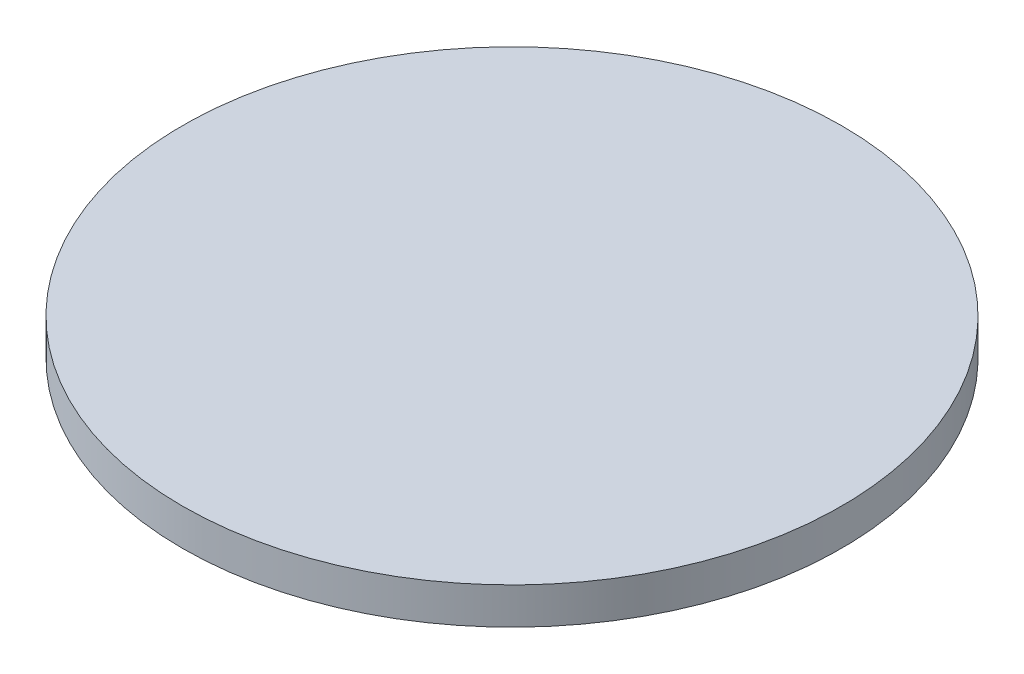
ISO-10303-21;
HEADER;
FILE_DESCRIPTION(('STEP AP214'),'2;1');
FILE_NAME('part.step','',(''),(''),'','','');
FILE_SCHEMA(('AUTOMOTIVE_DESIGN { 1 0 10303 214 1 1 1 1 }'));
ENDSEC;
DATA;
#1=APPLICATION_CONTEXT('core data for automotive mechanical design processes');
#2=APPLICATION_PROTOCOL_DEFINITION('international standard','automotive_design',2000,#1);
#3=PRODUCT_CONTEXT('',#1,'mechanical');
#4=PRODUCT('Part','Part','',(#3));
#5=PRODUCT_RELATED_PRODUCT_CATEGORY('part','',(#4));
#6=PRODUCT_DEFINITION_FORMATION('','',#4);
#7=PRODUCT_DEFINITION_CONTEXT('part definition',#1,'design');
#8=PRODUCT_DEFINITION('design','',#6,#7);
#9=PRODUCT_DEFINITION_SHAPE('','',#8);
#10=(LENGTH_UNIT() NAMED_UNIT(*) SI_UNIT(.MILLI.,.METRE.));
#11=(NAMED_UNIT(*) PLANE_ANGLE_UNIT() SI_UNIT($,.RADIAN.));
#12=(NAMED_UNIT(*) SI_UNIT($,.STERADIAN.) SOLID_ANGLE_UNIT());
#13=UNCERTAINTY_MEASURE_WITH_UNIT(LENGTH_MEASURE(1.E-05),#10,'distance_accuracy_value','');
#14=(GEOMETRIC_REPRESENTATION_CONTEXT(3) GLOBAL_UNCERTAINTY_ASSIGNED_CONTEXT((#13)) GLOBAL_UNIT_ASSIGNED_CONTEXT((#10,
#11,#12)) REPRESENTATION_CONTEXT('',''));
#15=CARTESIAN_POINT('',(0.,0.,0.));
#16=DIRECTION('',(0.,0.,1.));
#17=DIRECTION('',(1.,0.,0.));
#18=AXIS2_PLACEMENT_3D('',#15,#16,#17);
#19=CARTESIAN_POINT('',(0.,12.7,0.));
#20=DIRECTION('',(0.,-1.,0.));
#21=DIRECTION('',(0.,0.,-1.));
#22=AXIS2_PLACEMENT_3D('',#19,#20,#21);
#23=CYLINDRICAL_SURFACE('',#22,114.3);
#24=CARTESIAN_POINT('',(0.,12.7,0.));
#25=DIRECTION('',(0.,1.,0.));
#26=DIRECTION('',(0.,0.,1.));
#27=AXIS2_PLACEMENT_3D('',#24,#25,#26);
#28=CIRCLE('',#27,114.3);
#29=CARTESIAN_POINT('',(0.,12.7,-114.3));
#30=VERTEX_POINT('',#29);
#31=EDGE_CURVE('E10',#30,#30,#28,.T.);
#32=CARTESIAN_POINT('',(0.,0.,0.));
#33=DIRECTION('',(0.,1.,0.));
#34=DIRECTION('',(0.,0.,1.));
#35=AXIS2_PLACEMENT_3D('',#32,#33,#34);
#36=CIRCLE('',#35,114.3);
#37=CARTESIAN_POINT('',(0.,0.,-114.3));
#38=VERTEX_POINT('',#37);
#39=EDGE_CURVE('E34',#38,#38,#36,.T.);
#40=CARTESIAN_POINT('',(0.,12.7,-114.3));
#41=CARTESIAN_POINT('',(0.,12.5677083333333,-114.3));
#42=CARTESIAN_POINT('',(0.,12.4354166666667,-114.3));
#43=CARTESIAN_POINT('',(0.,12.1708333333333,-114.3));
#44=CARTESIAN_POINT('',(0.,12.0385416666667,-114.3));
#45=CARTESIAN_POINT('',(0.,11.7739583333333,-114.3));
#46=CARTESIAN_POINT('',(0.,11.6416666666667,-114.3));
#47=CARTESIAN_POINT('',(0.,11.3770833333333,-114.3));
#48=CARTESIAN_POINT('',(0.,11.2447916666667,-114.3));
#49=CARTESIAN_POINT('',(0.,10.9802083333333,-114.3));
#50=CARTESIAN_POINT('',(0.,10.8479166666667,-114.3));
#51=CARTESIAN_POINT('',(0.,10.5833333333333,-114.3));
#52=CARTESIAN_POINT('',(0.,10.4510416666667,-114.3));
#53=CARTESIAN_POINT('',(0.,10.1864583333333,-114.3));
#54=CARTESIAN_POINT('',(0.,10.0541666666667,-114.3));
#55=CARTESIAN_POINT('',(0.,9.78958333333333,-114.3));
#56=CARTESIAN_POINT('',(0.,9.65729166666667,-114.3));
#57=CARTESIAN_POINT('',(0.,9.39270833333333,-114.3));
#58=CARTESIAN_POINT('',(0.,9.26041666666667,-114.3));
#59=CARTESIAN_POINT('',(0.,8.99583333333333,-114.3));
#60=CARTESIAN_POINT('',(0.,8.86354166666667,-114.3));
#61=CARTESIAN_POINT('',(0.,8.59895833333333,-114.3));
#62=CARTESIAN_POINT('',(0.,8.46666666666667,-114.3));
#63=CARTESIAN_POINT('',(0.,8.20208333333333,-114.3));
#64=CARTESIAN_POINT('',(0.,8.06979166666667,-114.3));
#65=CARTESIAN_POINT('',(0.,7.80520833333333,-114.3));
#66=CARTESIAN_POINT('',(0.,7.67291666666667,-114.3));
#67=CARTESIAN_POINT('',(0.,7.40833333333333,-114.3));
#68=CARTESIAN_POINT('',(0.,7.27604166666667,-114.3));
#69=CARTESIAN_POINT('',(0.,7.01145833333333,-114.3));
#70=CARTESIAN_POINT('',(0.,6.87916666666667,-114.3));
#71=CARTESIAN_POINT('',(0.,6.61458333333333,-114.3));
#72=CARTESIAN_POINT('',(0.,6.48229166666667,-114.3));
#73=CARTESIAN_POINT('',(0.,6.21770833333333,-114.3));
#74=CARTESIAN_POINT('',(0.,6.08541666666667,-114.3));
#75=CARTESIAN_POINT('',(0.,5.82083333333333,-114.3));
#76=CARTESIAN_POINT('',(0.,5.68854166666667,-114.3));
#77=CARTESIAN_POINT('',(0.,5.42395833333333,-114.3));
#78=CARTESIAN_POINT('',(0.,5.29166666666667,-114.3));
#79=CARTESIAN_POINT('',(0.,5.02708333333333,-114.3));
#80=CARTESIAN_POINT('',(0.,4.89479166666667,-114.3));
#81=CARTESIAN_POINT('',(0.,4.63020833333333,-114.3));
#82=CARTESIAN_POINT('',(0.,4.49791666666667,-114.3));
#83=CARTESIAN_POINT('',(0.,4.23333333333333,-114.3));
#84=CARTESIAN_POINT('',(0.,4.10104166666667,-114.3));
#85=CARTESIAN_POINT('',(0.,3.83645833333333,-114.3));
#86=CARTESIAN_POINT('',(0.,3.70416666666667,-114.3));
#87=CARTESIAN_POINT('',(0.,3.43958333333333,-114.3));
#88=CARTESIAN_POINT('',(0.,3.30729166666667,-114.3));
#89=CARTESIAN_POINT('',(0.,3.04270833333333,-114.3));
#90=CARTESIAN_POINT('',(0.,2.91041666666667,-114.3));
#91=CARTESIAN_POINT('',(0.,2.64583333333333,-114.3));
#92=CARTESIAN_POINT('',(0.,2.51354166666667,-114.3));
#93=CARTESIAN_POINT('',(0.,2.24895833333333,-114.3));
#94=CARTESIAN_POINT('',(0.,2.11666666666667,-114.3));
#95=CARTESIAN_POINT('',(0.,1.85208333333333,-114.3));
#96=CARTESIAN_POINT('',(0.,1.71979166666667,-114.3));
#97=CARTESIAN_POINT('',(0.,1.45520833333333,-114.3));
#98=CARTESIAN_POINT('',(0.,1.32291666666667,-114.3));
#99=CARTESIAN_POINT('',(0.,1.05833333333333,-114.3));
#100=CARTESIAN_POINT('',(0.,0.926041666666666,-114.3));
#101=CARTESIAN_POINT('',(0.,0.661458333333333,-114.3));
#102=CARTESIAN_POINT('',(0.,0.529166666666666,-114.3));
#103=CARTESIAN_POINT('',(0.,0.264583333333333,-114.3));
#104=CARTESIAN_POINT('',(0.,0.132291666666667,-114.3));
#105=CARTESIAN_POINT('',(0.,0.,-114.3));
#106=B_SPLINE_CURVE_WITH_KNOTS('',3,(#40,#41,#42,#43,#44,#45,#46,#47,#48,#49,#50,#51,#52,#53,
#54,#55,#56,#57,#58,#59,#60,#61,#62,#63,#64,#65,#66,#67,#68,#69,#70,#71,#72,#73,#74,#75,#76,#77,
#78,#79,#80,#81,#82,#83,#84,#85,#86,#87,#88,#89,#90,#91,#92,#93,#94,#95,#96,#97,#98,#99,#100,
#101,#102,#103,#104,#105),.UNSPECIFIED.,.F.,.F.,(4,2,2,2,2,2,2,2,2,2,2,2,2,2,2,2,2,2,2,2,2,2,2,
2,2,2,2,2,2,2,2,2,4),(0.,0.396875000000001,0.793750000000001,1.190625,1.5875,1.984375,2.38125,
2.778125,3.175,3.571875,3.96875,4.365625,4.7625,5.159375,5.55625,5.953125,6.35,6.746875,7.14375,
7.540625,7.9375,8.334375,8.73125,9.128125,9.525,9.921875,10.31875,10.715625,11.1125,11.509375,
11.90625,12.303125,12.7),.UNSPECIFIED.);
#107=EDGE_CURVE('BSEAM31',#30,#38,#106,.T.);
#108=ORIENTED_EDGE('',*,*,#31,.F.);
#109=ORIENTED_EDGE('',*,*,#39,.T.);
#110=ORIENTED_EDGE('',*,*,#107,.T.);
#111=ORIENTED_EDGE('',*,*,#107,.F.);
#112=EDGE_LOOP('',(#108,#110,#109,#111));
#113=FACE_BOUND('',#112,.T.);
#114=ADVANCED_FACE('F31',(#113),#23,.T.);
#115=CARTESIAN_POINT('',(0.,12.7,0.));
#116=DIRECTION('',(0.,1.,0.));
#117=DIRECTION('',(0.,0.,1.));
#118=AXIS2_PLACEMENT_3D('',#115,#116,#117);
#119=PLANE('',#118);
#120=ORIENTED_EDGE('',*,*,#31,.T.);
#121=EDGE_LOOP('',(#120));
#122=FACE_BOUND('',#121,.T.);
#123=ADVANCED_FACE('F46',(#122),#119,.T.);
#124=CARTESIAN_POINT('',(0.,0.,0.));
#125=DIRECTION('',(0.,1.,0.));
#126=DIRECTION('',(0.,0.,1.));
#127=AXIS2_PLACEMENT_3D('',#124,#125,#126);
#128=PLANE('',#127);
#129=ORIENTED_EDGE('',*,*,#39,.F.);
#130=EDGE_LOOP('',(#129));
#131=FACE_BOUND('',#130,.T.);
#132=ADVANCED_FACE('F44',(#131),#128,.F.);
#133=CLOSED_SHELL('',(#114,#123,#132));
#134=MANIFOLD_SOLID_BREP('B2',#133);
#135=ADVANCED_BREP_SHAPE_REPRESENTATION('',(#18,#134),#14);
#136=SHAPE_DEFINITION_REPRESENTATION(#9,#135);
ENDSEC;
END-ISO-10303-21;
